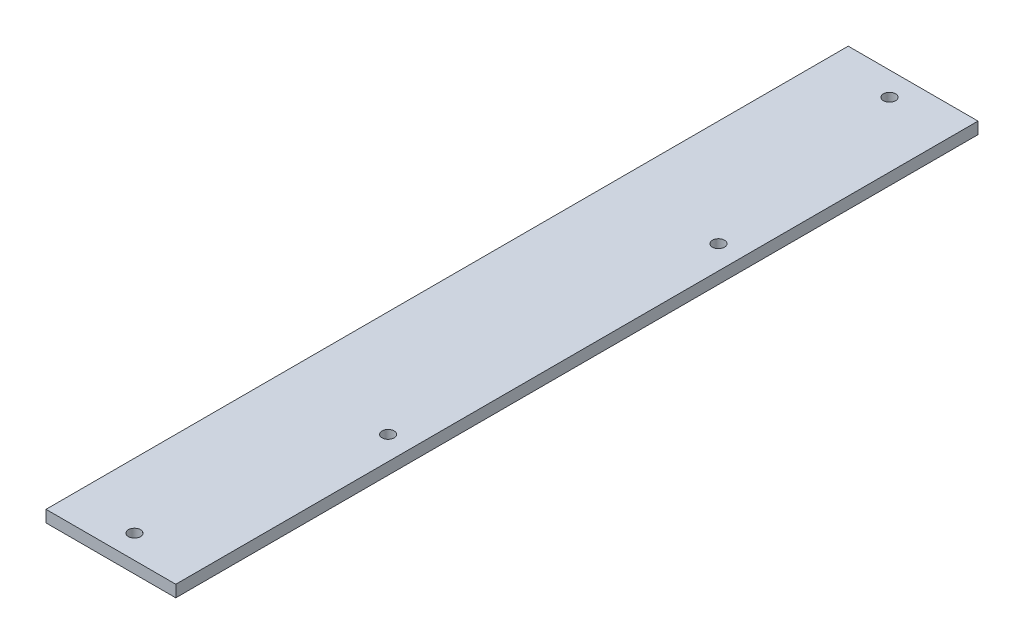
ISO-10303-21;
HEADER;
FILE_DESCRIPTION(('STEP AP214'),'2;1');
FILE_NAME('part.step','',(''),(''),'','','');
FILE_SCHEMA(('AUTOMOTIVE_DESIGN { 1 0 10303 214 1 1 1 1 }'));
ENDSEC;
DATA;
#1=APPLICATION_CONTEXT('core data for automotive mechanical design processes');
#2=APPLICATION_PROTOCOL_DEFINITION('international standard','automotive_design',2000,#1);
#3=PRODUCT_CONTEXT('',#1,'mechanical');
#4=PRODUCT('Part','Part','',(#3));
#5=PRODUCT_RELATED_PRODUCT_CATEGORY('part','',(#4));
#6=PRODUCT_DEFINITION_FORMATION('','',#4);
#7=PRODUCT_DEFINITION_CONTEXT('part definition',#1,'design');
#8=PRODUCT_DEFINITION('design','',#6,#7);
#9=PRODUCT_DEFINITION_SHAPE('','',#8);
#10=(LENGTH_UNIT() NAMED_UNIT(*) SI_UNIT(.MILLI.,.METRE.));
#11=(NAMED_UNIT(*) PLANE_ANGLE_UNIT() SI_UNIT($,.RADIAN.));
#12=(NAMED_UNIT(*) SI_UNIT($,.STERADIAN.) SOLID_ANGLE_UNIT());
#13=UNCERTAINTY_MEASURE_WITH_UNIT(LENGTH_MEASURE(1.E-05),#10,'distance_accuracy_value','');
#14=(GEOMETRIC_REPRESENTATION_CONTEXT(3) GLOBAL_UNCERTAINTY_ASSIGNED_CONTEXT((#13)) GLOBAL_UNIT_ASSIGNED_CONTEXT((#10,
#11,#12)) REPRESENTATION_CONTEXT('',''));
#15=CARTESIAN_POINT('',(0.,0.,0.));
#16=DIRECTION('',(0.,0.,1.));
#17=DIRECTION('',(1.,0.,0.));
#18=AXIS2_PLACEMENT_3D('',#15,#16,#17);
#19=CARTESIAN_POINT('',(0.,6.35,0.));
#20=DIRECTION('',(1.,0.,0.));
#21=DIRECTION('',(0.,0.,-1.));
#22=AXIS2_PLACEMENT_3D('',#19,#20,#21);
#23=PLANE('',#22);
#24=DIRECTION('',(0.,0.,1.));
#25=VECTOR('',#24,1.);
#26=CARTESIAN_POINT('',(0.,0.,0.));
#27=LINE('',#26,#25);
#28=CARTESIAN_POINT('',(0.,0.,-431.8));
#29=VERTEX_POINT('',#28);
#30=CARTESIAN_POINT('',(0.,0.,0.));
#31=VERTEX_POINT('',#30);
#32=EDGE_CURVE('E96',#29,#31,#27,.T.);
#33=ORIENTED_EDGE('',*,*,#32,.T.);
#34=DIRECTION('',(0.,-1.,0.));
#35=VECTOR('',#34,1.);
#36=CARTESIAN_POINT('',(0.,6.35,0.));
#37=LINE('',#36,#35);
#38=CARTESIAN_POINT('',(0.,6.35,0.));
#39=VERTEX_POINT('',#38);
#40=EDGE_CURVE('E11',#39,#31,#37,.T.);
#41=ORIENTED_EDGE('',*,*,#40,.F.);
#42=DIRECTION('',(0.,0.,1.));
#43=VECTOR('',#42,1.);
#44=CARTESIAN_POINT('',(0.,6.35,0.));
#45=LINE('',#44,#43);
#46=CARTESIAN_POINT('',(0.,6.35,-431.8));
#47=VERTEX_POINT('',#46);
#48=EDGE_CURVE('E84',#47,#39,#45,.T.);
#49=ORIENTED_EDGE('',*,*,#48,.F.);
#50=DIRECTION('',(0.,-1.,0.));
#51=VECTOR('',#50,1.);
#52=CARTESIAN_POINT('',(0.,6.35,-431.8));
#53=LINE('',#52,#51);
#54=EDGE_CURVE('E92',#47,#29,#53,.T.);
#55=ORIENTED_EDGE('',*,*,#54,.T.);
#56=EDGE_LOOP('',(#33,#41,#49,#55));
#57=FACE_BOUND('',#56,.T.);
#58=ADVANCED_FACE('F33',(#57),#23,.F.);
#59=CARTESIAN_POINT('',(0.,6.35,0.));
#60=DIRECTION('',(0.,0.,-1.));
#61=DIRECTION('',(-1.,0.,0.));
#62=AXIS2_PLACEMENT_3D('',#59,#60,#61);
#63=PLANE('',#62);
#64=DIRECTION('',(1.,0.,0.));
#65=VECTOR('',#64,1.);
#66=CARTESIAN_POINT('',(0.,0.,0.));
#67=LINE('',#66,#65);
#68=CARTESIAN_POINT('',(69.85,0.,0.));
#69=VERTEX_POINT('',#68);
#70=EDGE_CURVE('E88',#31,#69,#67,.T.);
#71=ORIENTED_EDGE('',*,*,#70,.T.);
#72=DIRECTION('',(0.,-1.,0.));
#73=VECTOR('',#72,1.);
#74=CARTESIAN_POINT('',(69.85,6.35,0.));
#75=LINE('',#74,#73);
#76=CARTESIAN_POINT('',(69.85,6.35,0.));
#77=VERTEX_POINT('',#76);
#78=EDGE_CURVE('E41',#77,#69,#75,.T.);
#79=ORIENTED_EDGE('',*,*,#78,.F.);
#80=DIRECTION('',(1.,0.,0.));
#81=VECTOR('',#80,1.);
#82=CARTESIAN_POINT('',(0.,6.35,0.));
#83=LINE('',#82,#81);
#84=EDGE_CURVE('E79',#39,#77,#83,.T.);
#85=ORIENTED_EDGE('',*,*,#84,.F.);
#86=ORIENTED_EDGE('',*,*,#40,.T.);
#87=EDGE_LOOP('',(#71,#79,#85,#86));
#88=FACE_BOUND('',#87,.T.);
#89=ADVANCED_FACE('F87',(#88),#63,.F.);
#90=CARTESIAN_POINT('',(69.85,6.35,0.));
#91=DIRECTION('',(-1.,0.,0.));
#92=DIRECTION('',(0.,0.,1.));
#93=AXIS2_PLACEMENT_3D('',#90,#91,#92);
#94=PLANE('',#93);
#95=DIRECTION('',(0.,0.,-1.));
#96=VECTOR('',#95,1.);
#97=CARTESIAN_POINT('',(69.85,0.,0.));
#98=LINE('',#97,#96);
#99=CARTESIAN_POINT('',(69.85,0.,-431.8));
#100=VERTEX_POINT('',#99);
#101=EDGE_CURVE('E66',#69,#100,#98,.T.);
#102=ORIENTED_EDGE('',*,*,#101,.T.);
#103=DIRECTION('',(0.,-1.,0.));
#104=VECTOR('',#103,1.);
#105=CARTESIAN_POINT('',(69.85,6.35,-431.8));
#106=LINE('',#105,#104);
#107=CARTESIAN_POINT('',(69.85,6.35,-431.8));
#108=VERTEX_POINT('',#107);
#109=EDGE_CURVE('E89',#108,#100,#106,.T.);
#110=ORIENTED_EDGE('',*,*,#109,.F.);
#111=DIRECTION('',(0.,0.,-1.));
#112=VECTOR('',#111,1.);
#113=CARTESIAN_POINT('',(69.85,6.35,0.));
#114=LINE('',#113,#112);
#115=EDGE_CURVE('E82',#77,#108,#114,.T.);
#116=ORIENTED_EDGE('',*,*,#115,.F.);
#117=ORIENTED_EDGE('',*,*,#78,.T.);
#118=EDGE_LOOP('',(#102,#110,#116,#117));
#119=FACE_BOUND('',#118,.T.);
#120=ADVANCED_FACE('F90',(#119),#94,.F.);
#121=CARTESIAN_POINT('',(0.,6.35,-431.8));
#122=DIRECTION('',(0.,0.,1.));
#123=DIRECTION('',(1.,0.,0.));
#124=AXIS2_PLACEMENT_3D('',#121,#122,#123);
#125=PLANE('',#124);
#126=DIRECTION('',(-1.,0.,0.));
#127=VECTOR('',#126,1.);
#128=CARTESIAN_POINT('',(0.,0.,-431.8));
#129=LINE('',#128,#127);
#130=EDGE_CURVE('E72',#100,#29,#129,.T.);
#131=ORIENTED_EDGE('',*,*,#130,.T.);
#132=ORIENTED_EDGE('',*,*,#54,.F.);
#133=DIRECTION('',(-1.,0.,0.));
#134=VECTOR('',#133,1.);
#135=CARTESIAN_POINT('',(0.,6.35,-431.8));
#136=LINE('',#135,#134);
#137=EDGE_CURVE('E49',#108,#47,#136,.T.);
#138=ORIENTED_EDGE('',*,*,#137,.F.);
#139=ORIENTED_EDGE('',*,*,#109,.T.);
#140=EDGE_LOOP('',(#131,#132,#138,#139));
#141=FACE_BOUND('',#140,.T.);
#142=ADVANCED_FACE('F104',(#141),#125,.F.);
#143=CARTESIAN_POINT('',(0.,6.35,0.));
#144=DIRECTION('',(0.,-1.,0.));
#145=DIRECTION('',(0.,0.,-1.));
#146=AXIS2_PLACEMENT_3D('',#143,#144,#145);
#147=PLANE('',#146);
#148=CARTESIAN_POINT('',(34.925,6.35,-419.1));
#149=DIRECTION('',(0.,1.,0.));
#150=DIRECTION('',(0.,0.,1.));
#151=AXIS2_PLACEMENT_3D('',#148,#149,#150);
#152=CIRCLE('',#151,3.26390000000001);
#153=CARTESIAN_POINT('',(34.925,6.35,-415.8361));
#154=VERTEX_POINT('',#153);
#155=EDGE_CURVE('E128',#154,#154,#152,.T.);
#156=ORIENTED_EDGE('',*,*,#155,.F.);
#157=EDGE_LOOP('',(#156));
#158=FACE_BOUND('',#157,.T.);
#159=CARTESIAN_POINT('',(57.1500000000001,6.35,-304.8));
#160=DIRECTION('',(0.,1.,0.));
#161=DIRECTION('',(0.,0.,1.));
#162=AXIS2_PLACEMENT_3D('',#159,#160,#161);
#163=CIRCLE('',#162,3.26390000000002);
#164=CARTESIAN_POINT('',(57.1500000000001,6.35,-301.5361));
#165=VERTEX_POINT('',#164);
#166=EDGE_CURVE('E122',#165,#165,#163,.T.);
#167=ORIENTED_EDGE('',*,*,#166,.F.);
#168=EDGE_LOOP('',(#167));
#169=FACE_BOUND('',#168,.T.);
#170=CARTESIAN_POINT('',(57.1500000000001,6.35,-127.));
#171=DIRECTION('',(0.,1.,0.));
#172=DIRECTION('',(0.,0.,-1.));
#173=AXIS2_PLACEMENT_3D('',#170,#171,#172);
#174=CIRCLE('',#173,3.26390000000002);
#175=CARTESIAN_POINT('',(57.1500000000001,6.35,-130.2639));
#176=VERTEX_POINT('',#175);
#177=EDGE_CURVE('E116',#176,#176,#174,.T.);
#178=ORIENTED_EDGE('',*,*,#177,.F.);
#179=EDGE_LOOP('',(#178));
#180=FACE_BOUND('',#179,.T.);
#181=CARTESIAN_POINT('',(34.925,6.35,-12.7));
#182=DIRECTION('',(0.,1.,0.));
#183=DIRECTION('',(0.,0.,-1.));
#184=AXIS2_PLACEMENT_3D('',#181,#182,#183);
#185=CIRCLE('',#184,3.26390000000001);
#186=CARTESIAN_POINT('',(34.925,6.35,-15.9639));
#187=VERTEX_POINT('',#186);
#188=EDGE_CURVE('E110',#187,#187,#185,.T.);
#189=ORIENTED_EDGE('',*,*,#188,.F.);
#190=EDGE_LOOP('',(#189));
#191=FACE_BOUND('',#190,.T.);
#192=ORIENTED_EDGE('',*,*,#48,.T.);
#193=ORIENTED_EDGE('',*,*,#84,.T.);
#194=ORIENTED_EDGE('',*,*,#115,.T.);
#195=ORIENTED_EDGE('',*,*,#137,.T.);
#196=EDGE_LOOP('',(#192,#193,#194,#195));
#197=FACE_BOUND('',#196,.T.);
#198=ADVANCED_FACE('F80',(#158,#169,#180,#191,#197),#147,.F.);
#199=CARTESIAN_POINT('',(0.,0.,0.));
#200=DIRECTION('',(0.,-1.,0.));
#201=DIRECTION('',(0.,0.,-1.));
#202=AXIS2_PLACEMENT_3D('',#199,#200,#201);
#203=PLANE('',#202);
#204=CARTESIAN_POINT('',(34.925,0.,-419.1));
#205=DIRECTION('',(0.,1.,0.));
#206=DIRECTION('',(0.,0.,1.));
#207=AXIS2_PLACEMENT_3D('',#204,#205,#206);
#208=CIRCLE('',#207,3.26390000000001);
#209=CARTESIAN_POINT('',(34.925,0.,-415.8361));
#210=VERTEX_POINT('',#209);
#211=EDGE_CURVE('E99',#210,#210,#208,.T.);
#212=ORIENTED_EDGE('',*,*,#211,.T.);
#213=EDGE_LOOP('',(#212));
#214=FACE_BOUND('',#213,.T.);
#215=CARTESIAN_POINT('',(57.1500000000001,0.,-304.8));
#216=DIRECTION('',(0.,1.,0.));
#217=DIRECTION('',(0.,0.,1.));
#218=AXIS2_PLACEMENT_3D('',#215,#216,#217);
#219=CIRCLE('',#218,3.26390000000002);
#220=CARTESIAN_POINT('',(57.1500000000001,0.,-301.5361));
#221=VERTEX_POINT('',#220);
#222=EDGE_CURVE('E125',#221,#221,#219,.T.);
#223=ORIENTED_EDGE('',*,*,#222,.T.);
#224=EDGE_LOOP('',(#223));
#225=FACE_BOUND('',#224,.T.);
#226=CARTESIAN_POINT('',(57.1500000000001,0.,-127.));
#227=DIRECTION('',(0.,1.,0.));
#228=DIRECTION('',(0.,0.,-1.));
#229=AXIS2_PLACEMENT_3D('',#226,#227,#228);
#230=CIRCLE('',#229,3.26390000000002);
#231=CARTESIAN_POINT('',(57.1500000000001,0.,-130.2639));
#232=VERTEX_POINT('',#231);
#233=EDGE_CURVE('E119',#232,#232,#230,.T.);
#234=ORIENTED_EDGE('',*,*,#233,.T.);
#235=EDGE_LOOP('',(#234));
#236=FACE_BOUND('',#235,.T.);
#237=CARTESIAN_POINT('',(34.925,0.,-12.7));
#238=DIRECTION('',(0.,1.,0.));
#239=DIRECTION('',(0.,0.,-1.));
#240=AXIS2_PLACEMENT_3D('',#237,#238,#239);
#241=CIRCLE('',#240,3.26390000000001);
#242=CARTESIAN_POINT('',(34.925,0.,-15.9639));
#243=VERTEX_POINT('',#242);
#244=EDGE_CURVE('E113',#243,#243,#241,.T.);
#245=ORIENTED_EDGE('',*,*,#244,.T.);
#246=EDGE_LOOP('',(#245));
#247=FACE_BOUND('',#246,.T.);
#248=ORIENTED_EDGE('',*,*,#32,.F.);
#249=ORIENTED_EDGE('',*,*,#130,.F.);
#250=ORIENTED_EDGE('',*,*,#101,.F.);
#251=ORIENTED_EDGE('',*,*,#70,.F.);
#252=EDGE_LOOP('',(#248,#249,#250,#251));
#253=FACE_BOUND('',#252,.T.);
#254=ADVANCED_FACE('F107',(#214,#225,#236,#247,#253),#203,.T.);
#255=CARTESIAN_POINT('',(34.925,0.,-12.7));
#256=DIRECTION('',(0.,1.,0.));
#257=DIRECTION('',(0.,0.,1.));
#258=AXIS2_PLACEMENT_3D('',#255,#256,#257);
#259=CYLINDRICAL_SURFACE('',#258,3.26390000000001);
#260=ORIENTED_EDGE('',*,*,#244,.F.);
#261=EDGE_LOOP('',(#260));
#262=FACE_BOUND('',#261,.T.);
#263=ORIENTED_EDGE('',*,*,#188,.T.);
#264=EDGE_LOOP('',(#263));
#265=FACE_BOUND('',#264,.T.);
#266=ADVANCED_FACE('F152',(#262,#265),#259,.F.);
#267=CARTESIAN_POINT('',(57.1500000000001,0.,-127.));
#268=DIRECTION('',(0.,1.,0.));
#269=DIRECTION('',(0.,0.,1.));
#270=AXIS2_PLACEMENT_3D('',#267,#268,#269);
#271=CYLINDRICAL_SURFACE('',#270,3.26390000000002);
#272=ORIENTED_EDGE('',*,*,#233,.F.);
#273=EDGE_LOOP('',(#272));
#274=FACE_BOUND('',#273,.T.);
#275=ORIENTED_EDGE('',*,*,#177,.T.);
#276=EDGE_LOOP('',(#275));
#277=FACE_BOUND('',#276,.T.);
#278=ADVANCED_FACE('F154',(#274,#277),#271,.F.);
#279=CARTESIAN_POINT('',(57.1500000000001,0.,-304.8));
#280=DIRECTION('',(0.,1.,0.));
#281=DIRECTION('',(0.,0.,1.));
#282=AXIS2_PLACEMENT_3D('',#279,#280,#281);
#283=CYLINDRICAL_SURFACE('',#282,3.26390000000002);
#284=ORIENTED_EDGE('',*,*,#222,.F.);
#285=EDGE_LOOP('',(#284));
#286=FACE_BOUND('',#285,.T.);
#287=ORIENTED_EDGE('',*,*,#166,.T.);
#288=EDGE_LOOP('',(#287));
#289=FACE_BOUND('',#288,.T.);
#290=ADVANCED_FACE('F139',(#286,#289),#283,.F.);
#291=CARTESIAN_POINT('',(34.925,0.,-419.1));
#292=DIRECTION('',(0.,1.,0.));
#293=DIRECTION('',(0.,0.,1.));
#294=AXIS2_PLACEMENT_3D('',#291,#292,#293);
#295=CYLINDRICAL_SURFACE('',#294,3.26390000000001);
#296=ORIENTED_EDGE('',*,*,#211,.F.);
#297=EDGE_LOOP('',(#296));
#298=FACE_BOUND('',#297,.T.);
#299=ORIENTED_EDGE('',*,*,#155,.T.);
#300=EDGE_LOOP('',(#299));
#301=FACE_BOUND('',#300,.T.);
#302=ADVANCED_FACE('F136',(#298,#301),#295,.F.);
#303=CLOSED_SHELL('',(#58,#89,#120,#142,#198,#254,#266,#278,#290,#302));
#304=MANIFOLD_SOLID_BREP('B2',#303);
#305=ADVANCED_BREP_SHAPE_REPRESENTATION('',(#18,#304),#14);
#306=SHAPE_DEFINITION_REPRESENTATION(#9,#305);
ENDSEC;
END-ISO-10303-21;
